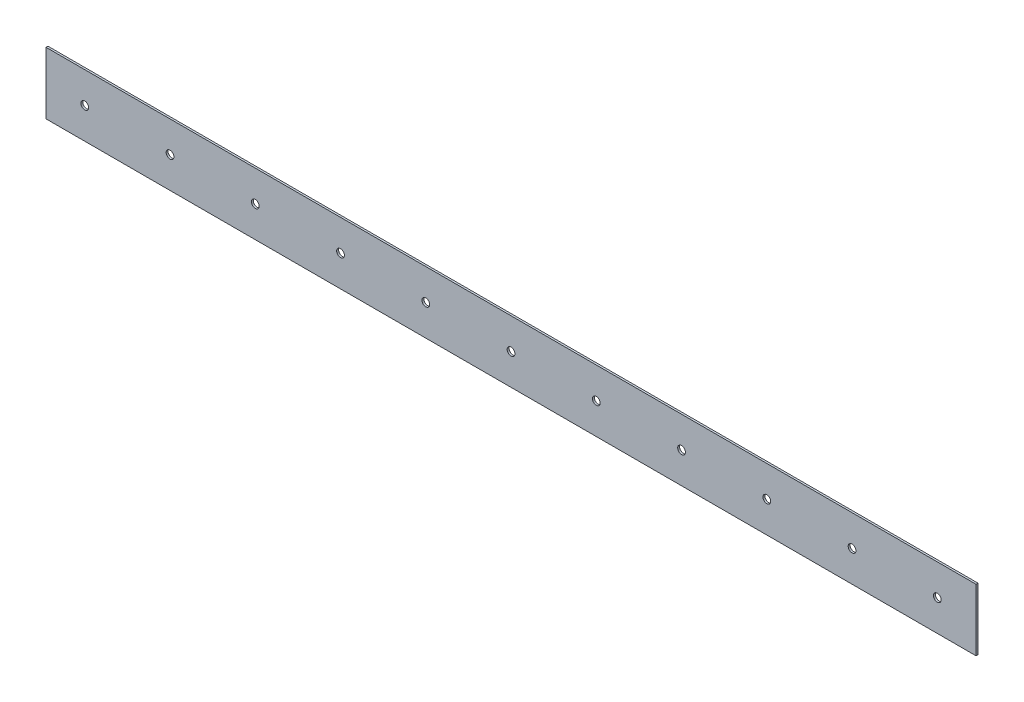
ISO-10303-21;
HEADER;
FILE_DESCRIPTION(('STEP AP214'),'2;1');
FILE_NAME('part.step','',(''),(''),'','','');
FILE_SCHEMA(('AUTOMOTIVE_DESIGN { 1 0 10303 214 1 1 1 1 }'));
ENDSEC;
DATA;
#1=APPLICATION_CONTEXT('core data for automotive mechanical design processes');
#2=APPLICATION_PROTOCOL_DEFINITION('international standard','automotive_design',2000,#1);
#3=PRODUCT_CONTEXT('',#1,'mechanical');
#4=PRODUCT('Part','Part','',(#3));
#5=PRODUCT_RELATED_PRODUCT_CATEGORY('part','',(#4));
#6=PRODUCT_DEFINITION_FORMATION('','',#4);
#7=PRODUCT_DEFINITION_CONTEXT('part definition',#1,'design');
#8=PRODUCT_DEFINITION('design','',#6,#7);
#9=PRODUCT_DEFINITION_SHAPE('','',#8);
#10=(LENGTH_UNIT() NAMED_UNIT(*) SI_UNIT(.MILLI.,.METRE.));
#11=(NAMED_UNIT(*) PLANE_ANGLE_UNIT() SI_UNIT($,.RADIAN.));
#12=(NAMED_UNIT(*) SI_UNIT($,.STERADIAN.) SOLID_ANGLE_UNIT());
#13=UNCERTAINTY_MEASURE_WITH_UNIT(LENGTH_MEASURE(1.E-05),#10,'distance_accuracy_value','');
#14=(GEOMETRIC_REPRESENTATION_CONTEXT(3) GLOBAL_UNCERTAINTY_ASSIGNED_CONTEXT((#13)) GLOBAL_UNIT_ASSIGNED_CONTEXT((#10,
#11,#12)) REPRESENTATION_CONTEXT('',''));
#15=CARTESIAN_POINT('',(0.,0.,0.));
#16=DIRECTION('',(0.,0.,1.));
#17=DIRECTION('',(1.,0.,0.));
#18=AXIS2_PLACEMENT_3D('',#15,#16,#17);
#19=CARTESIAN_POINT('',(0.,0.,6.35));
#20=DIRECTION('',(0.,0.,1.));
#21=DIRECTION('',(1.,0.,0.));
#22=AXIS2_PLACEMENT_3D('',#19,#20,#21);
#23=PLANE('',#22);
#24=CARTESIAN_POINT('',(1117.6,0.,6.35));
#25=DIRECTION('',(0.,0.,1.));
#26=DIRECTION('',(1.,0.,0.));
#27=AXIS2_PLACEMENT_3D('',#24,#25,#26);
#28=CIRCLE('',#27,12.6999999999999);
#29=CARTESIAN_POINT('',(1130.3,0.,6.35));
#30=VERTEX_POINT('',#29);
#31=EDGE_CURVE('E198',#30,#30,#28,.T.);
#32=ORIENTED_EDGE('',*,*,#31,.F.);
#33=EDGE_LOOP('',(#32));
#34=FACE_BOUND('',#33,.T.);
#35=CARTESIAN_POINT('',(558.8,0.,6.35));
#36=DIRECTION('',(0.,0.,1.));
#37=DIRECTION('',(1.,0.,0.));
#38=AXIS2_PLACEMENT_3D('',#35,#36,#37);
#39=CIRCLE('',#38,12.6999999999999);
#40=CARTESIAN_POINT('',(571.5,0.,6.35));
#41=VERTEX_POINT('',#40);
#42=EDGE_CURVE('E182',#41,#41,#39,.T.);
#43=ORIENTED_EDGE('',*,*,#42,.F.);
#44=EDGE_LOOP('',(#43));
#45=FACE_BOUND('',#44,.T.);
#46=CARTESIAN_POINT('',(-4.44089209850063E-13,0.,6.35));
#47=DIRECTION('',(0.,0.,1.));
#48=DIRECTION('',(1.,0.,0.));
#49=AXIS2_PLACEMENT_3D('',#46,#47,#48);
#50=CIRCLE('',#49,12.6999999999999);
#51=CARTESIAN_POINT('',(12.6999999999994,0.,6.35));
#52=VERTEX_POINT('',#51);
#53=EDGE_CURVE('E166',#52,#52,#50,.T.);
#54=ORIENTED_EDGE('',*,*,#53,.F.);
#55=EDGE_LOOP('',(#54));
#56=FACE_BOUND('',#55,.T.);
#57=CARTESIAN_POINT('',(-558.8,0.,6.35));
#58=DIRECTION('',(0.,0.,1.));
#59=DIRECTION('',(1.,0.,0.));
#60=AXIS2_PLACEMENT_3D('',#57,#58,#59);
#61=CIRCLE('',#60,12.6999999999999);
#62=CARTESIAN_POINT('',(-546.1,0.,6.35));
#63=VERTEX_POINT('',#62);
#64=EDGE_CURVE('E150',#63,#63,#61,.T.);
#65=ORIENTED_EDGE('',*,*,#64,.F.);
#66=EDGE_LOOP('',(#65));
#67=FACE_BOUND('',#66,.T.);
#68=CARTESIAN_POINT('',(-1117.6,0.,6.35));
#69=DIRECTION('',(0.,0.,1.));
#70=DIRECTION('',(1.,0.,0.));
#71=AXIS2_PLACEMENT_3D('',#68,#69,#70);
#72=CIRCLE('',#71,12.6999999999999);
#73=CARTESIAN_POINT('',(-1104.9,0.,6.35));
#74=VERTEX_POINT('',#73);
#75=EDGE_CURVE('E134',#74,#74,#72,.T.);
#76=ORIENTED_EDGE('',*,*,#75,.F.);
#77=EDGE_LOOP('',(#76));
#78=FACE_BOUND('',#77,.T.);
#79=DIRECTION('',(0.,1.,0.));
#80=VECTOR('',#79,1.);
#81=CARTESIAN_POINT('',(1524.,101.6,6.35));
#82=LINE('',#81,#80);
#83=CARTESIAN_POINT('',(1524.,-101.6,6.35));
#84=VERTEX_POINT('',#83);
#85=CARTESIAN_POINT('',(1524.,101.6,6.35));
#86=VERTEX_POINT('',#85);
#87=EDGE_CURVE('E92',#84,#86,#82,.T.);
#88=ORIENTED_EDGE('',*,*,#87,.T.);
#89=DIRECTION('',(-1.,0.,0.));
#90=VECTOR('',#89,1.);
#91=CARTESIAN_POINT('',(-1524.,101.6,6.35));
#92=LINE('',#91,#90);
#93=CARTESIAN_POINT('',(-1524.,101.6,6.35));
#94=VERTEX_POINT('',#93);
#95=EDGE_CURVE('E87',#86,#94,#92,.T.);
#96=ORIENTED_EDGE('',*,*,#95,.T.);
#97=DIRECTION('',(0.,-1.,0.));
#98=VECTOR('',#97,1.);
#99=CARTESIAN_POINT('',(-1524.,101.6,6.35));
#100=LINE('',#99,#98);
#101=CARTESIAN_POINT('',(-1524.,-101.6,6.35));
#102=VERTEX_POINT('',#101);
#103=EDGE_CURVE('E90',#94,#102,#100,.T.);
#104=ORIENTED_EDGE('',*,*,#103,.T.);
#105=DIRECTION('',(1.,0.,0.));
#106=VECTOR('',#105,1.);
#107=CARTESIAN_POINT('',(-1524.,-101.6,6.35));
#108=LINE('',#107,#106);
#109=EDGE_CURVE('E57',#102,#84,#108,.T.);
#110=ORIENTED_EDGE('',*,*,#109,.T.);
#111=EDGE_LOOP('',(#88,#96,#104,#110));
#112=FACE_BOUND('',#111,.T.);
#113=CARTESIAN_POINT('',(-1397.,0.,6.35));
#114=DIRECTION('',(0.,0.,1.));
#115=DIRECTION('',(1.,0.,0.));
#116=AXIS2_PLACEMENT_3D('',#113,#114,#115);
#117=CIRCLE('',#116,12.6999999999999);
#118=CARTESIAN_POINT('',(-1384.3,0.,6.35));
#119=VERTEX_POINT('',#118);
#120=EDGE_CURVE('E112',#119,#119,#117,.T.);
#121=ORIENTED_EDGE('',*,*,#120,.F.);
#122=EDGE_LOOP('',(#121));
#123=FACE_BOUND('',#122,.T.);
#124=CARTESIAN_POINT('',(-838.2,0.,6.35));
#125=DIRECTION('',(0.,0.,1.));
#126=DIRECTION('',(1.,0.,0.));
#127=AXIS2_PLACEMENT_3D('',#124,#125,#126);
#128=CIRCLE('',#127,12.6999999999999);
#129=CARTESIAN_POINT('',(-825.5,0.,6.35));
#130=VERTEX_POINT('',#129);
#131=EDGE_CURVE('E142',#130,#130,#128,.T.);
#132=ORIENTED_EDGE('',*,*,#131,.F.);
#133=EDGE_LOOP('',(#132));
#134=FACE_BOUND('',#133,.T.);
#135=CARTESIAN_POINT('',(-279.4,0.,6.35));
#136=DIRECTION('',(0.,0.,1.));
#137=DIRECTION('',(1.,0.,0.));
#138=AXIS2_PLACEMENT_3D('',#135,#136,#137);
#139=CIRCLE('',#138,12.6999999999999);
#140=CARTESIAN_POINT('',(-266.7,0.,6.35));
#141=VERTEX_POINT('',#140);
#142=EDGE_CURVE('E158',#141,#141,#139,.T.);
#143=ORIENTED_EDGE('',*,*,#142,.F.);
#144=EDGE_LOOP('',(#143));
#145=FACE_BOUND('',#144,.T.);
#146=CARTESIAN_POINT('',(279.4,0.,6.35));
#147=DIRECTION('',(0.,0.,1.));
#148=DIRECTION('',(1.,0.,0.));
#149=AXIS2_PLACEMENT_3D('',#146,#147,#148);
#150=CIRCLE('',#149,12.6999999999999);
#151=CARTESIAN_POINT('',(292.1,0.,6.35));
#152=VERTEX_POINT('',#151);
#153=EDGE_CURVE('E174',#152,#152,#150,.T.);
#154=ORIENTED_EDGE('',*,*,#153,.F.);
#155=EDGE_LOOP('',(#154));
#156=FACE_BOUND('',#155,.T.);
#157=CARTESIAN_POINT('',(838.2,0.,6.35));
#158=DIRECTION('',(0.,0.,1.));
#159=DIRECTION('',(1.,0.,0.));
#160=AXIS2_PLACEMENT_3D('',#157,#158,#159);
#161=CIRCLE('',#160,12.6999999999999);
#162=CARTESIAN_POINT('',(850.9,0.,6.35));
#163=VERTEX_POINT('',#162);
#164=EDGE_CURVE('E190',#163,#163,#161,.T.);
#165=ORIENTED_EDGE('',*,*,#164,.F.);
#166=EDGE_LOOP('',(#165));
#167=FACE_BOUND('',#166,.T.);
#168=CARTESIAN_POINT('',(1397.,0.,6.35));
#169=DIRECTION('',(0.,0.,1.));
#170=DIRECTION('',(1.,0.,0.));
#171=AXIS2_PLACEMENT_3D('',#168,#169,#170);
#172=CIRCLE('',#171,12.6999999999999);
#173=CARTESIAN_POINT('',(1409.7,0.,6.35));
#174=VERTEX_POINT('',#173);
#175=EDGE_CURVE('E206',#174,#174,#172,.T.);
#176=ORIENTED_EDGE('',*,*,#175,.F.);
#177=EDGE_LOOP('',(#176));
#178=FACE_BOUND('',#177,.T.);
#179=ADVANCED_FACE('F39',(#34,#45,#56,#67,#78,#112,#123,#134,#145,#156,#167,#178),#23,.T.);
#180=CARTESIAN_POINT('',(0.,0.,0.));
#181=DIRECTION('',(0.,0.,1.));
#182=DIRECTION('',(1.,0.,0.));
#183=AXIS2_PLACEMENT_3D('',#180,#181,#182);
#184=PLANE('',#183);
#185=DIRECTION('',(0.,1.,0.));
#186=VECTOR('',#185,1.);
#187=CARTESIAN_POINT('',(1524.,101.6,0.));
#188=LINE('',#187,#186);
#189=CARTESIAN_POINT('',(1524.,-101.6,0.));
#190=VERTEX_POINT('',#189);
#191=CARTESIAN_POINT('',(1524.,101.6,0.));
#192=VERTEX_POINT('',#191);
#193=EDGE_CURVE('E108',#190,#192,#188,.T.);
#194=ORIENTED_EDGE('',*,*,#193,.F.);
#195=DIRECTION('',(1.,0.,0.));
#196=VECTOR('',#195,1.);
#197=CARTESIAN_POINT('',(-1524.,-101.6,0.));
#198=LINE('',#197,#196);
#199=CARTESIAN_POINT('',(-1524.,-101.6,0.));
#200=VERTEX_POINT('',#199);
#201=EDGE_CURVE('E80',#200,#190,#198,.T.);
#202=ORIENTED_EDGE('',*,*,#201,.F.);
#203=DIRECTION('',(0.,-1.,0.));
#204=VECTOR('',#203,1.);
#205=CARTESIAN_POINT('',(-1524.,101.6,0.));
#206=LINE('',#205,#204);
#207=CARTESIAN_POINT('',(-1524.,101.6,0.));
#208=VERTEX_POINT('',#207);
#209=EDGE_CURVE('E74',#208,#200,#206,.T.);
#210=ORIENTED_EDGE('',*,*,#209,.F.);
#211=DIRECTION('',(-1.,0.,0.));
#212=VECTOR('',#211,1.);
#213=CARTESIAN_POINT('',(-1524.,101.6,0.));
#214=LINE('',#213,#212);
#215=EDGE_CURVE('E97',#192,#208,#214,.T.);
#216=ORIENTED_EDGE('',*,*,#215,.F.);
#217=EDGE_LOOP('',(#194,#202,#210,#216));
#218=FACE_BOUND('',#217,.T.);
#219=CARTESIAN_POINT('',(-1397.,0.,0.));
#220=DIRECTION('',(0.,0.,1.));
#221=DIRECTION('',(1.,0.,0.));
#222=AXIS2_PLACEMENT_3D('',#219,#220,#221);
#223=CIRCLE('',#222,12.6999999999999);
#224=CARTESIAN_POINT('',(-1384.3,0.,0.));
#225=VERTEX_POINT('',#224);
#226=EDGE_CURVE('E130',#225,#225,#223,.T.);
#227=ORIENTED_EDGE('',*,*,#226,.T.);
#228=EDGE_LOOP('',(#227));
#229=FACE_BOUND('',#228,.T.);
#230=CARTESIAN_POINT('',(-1117.6,0.,0.));
#231=DIRECTION('',(0.,0.,1.));
#232=DIRECTION('',(1.,0.,0.));
#233=AXIS2_PLACEMENT_3D('',#230,#231,#232);
#234=CIRCLE('',#233,12.6999999999999);
#235=CARTESIAN_POINT('',(-1104.9,0.,0.));
#236=VERTEX_POINT('',#235);
#237=EDGE_CURVE('E138',#236,#236,#234,.T.);
#238=ORIENTED_EDGE('',*,*,#237,.T.);
#239=EDGE_LOOP('',(#238));
#240=FACE_BOUND('',#239,.T.);
#241=CARTESIAN_POINT('',(-838.2,0.,0.));
#242=DIRECTION('',(0.,0.,1.));
#243=DIRECTION('',(1.,0.,0.));
#244=AXIS2_PLACEMENT_3D('',#241,#242,#243);
#245=CIRCLE('',#244,12.6999999999999);
#246=CARTESIAN_POINT('',(-825.5,0.,0.));
#247=VERTEX_POINT('',#246);
#248=EDGE_CURVE('E146',#247,#247,#245,.T.);
#249=ORIENTED_EDGE('',*,*,#248,.T.);
#250=EDGE_LOOP('',(#249));
#251=FACE_BOUND('',#250,.T.);
#252=CARTESIAN_POINT('',(-558.8,0.,0.));
#253=DIRECTION('',(0.,0.,1.));
#254=DIRECTION('',(1.,0.,0.));
#255=AXIS2_PLACEMENT_3D('',#252,#253,#254);
#256=CIRCLE('',#255,12.6999999999999);
#257=CARTESIAN_POINT('',(-546.1,0.,0.));
#258=VERTEX_POINT('',#257);
#259=EDGE_CURVE('E154',#258,#258,#256,.T.);
#260=ORIENTED_EDGE('',*,*,#259,.T.);
#261=EDGE_LOOP('',(#260));
#262=FACE_BOUND('',#261,.T.);
#263=CARTESIAN_POINT('',(-279.4,0.,0.));
#264=DIRECTION('',(0.,0.,1.));
#265=DIRECTION('',(1.,0.,0.));
#266=AXIS2_PLACEMENT_3D('',#263,#264,#265);
#267=CIRCLE('',#266,12.6999999999999);
#268=CARTESIAN_POINT('',(-266.7,0.,0.));
#269=VERTEX_POINT('',#268);
#270=EDGE_CURVE('E162',#269,#269,#267,.T.);
#271=ORIENTED_EDGE('',*,*,#270,.T.);
#272=EDGE_LOOP('',(#271));
#273=FACE_BOUND('',#272,.T.);
#274=CARTESIAN_POINT('',(-4.44089209850063E-13,0.,0.));
#275=DIRECTION('',(0.,0.,1.));
#276=DIRECTION('',(1.,0.,0.));
#277=AXIS2_PLACEMENT_3D('',#274,#275,#276);
#278=CIRCLE('',#277,12.6999999999999);
#279=CARTESIAN_POINT('',(12.6999999999994,0.,0.));
#280=VERTEX_POINT('',#279);
#281=EDGE_CURVE('E170',#280,#280,#278,.T.);
#282=ORIENTED_EDGE('',*,*,#281,.T.);
#283=EDGE_LOOP('',(#282));
#284=FACE_BOUND('',#283,.T.);
#285=CARTESIAN_POINT('',(279.4,0.,0.));
#286=DIRECTION('',(0.,0.,1.));
#287=DIRECTION('',(1.,0.,0.));
#288=AXIS2_PLACEMENT_3D('',#285,#286,#287);
#289=CIRCLE('',#288,12.6999999999999);
#290=CARTESIAN_POINT('',(292.1,0.,0.));
#291=VERTEX_POINT('',#290);
#292=EDGE_CURVE('E178',#291,#291,#289,.T.);
#293=ORIENTED_EDGE('',*,*,#292,.T.);
#294=EDGE_LOOP('',(#293));
#295=FACE_BOUND('',#294,.T.);
#296=CARTESIAN_POINT('',(558.8,0.,0.));
#297=DIRECTION('',(0.,0.,1.));
#298=DIRECTION('',(1.,0.,0.));
#299=AXIS2_PLACEMENT_3D('',#296,#297,#298);
#300=CIRCLE('',#299,12.6999999999999);
#301=CARTESIAN_POINT('',(571.5,0.,0.));
#302=VERTEX_POINT('',#301);
#303=EDGE_CURVE('E186',#302,#302,#300,.T.);
#304=ORIENTED_EDGE('',*,*,#303,.T.);
#305=EDGE_LOOP('',(#304));
#306=FACE_BOUND('',#305,.T.);
#307=CARTESIAN_POINT('',(838.2,0.,0.));
#308=DIRECTION('',(0.,0.,1.));
#309=DIRECTION('',(1.,0.,0.));
#310=AXIS2_PLACEMENT_3D('',#307,#308,#309);
#311=CIRCLE('',#310,12.6999999999999);
#312=CARTESIAN_POINT('',(850.9,0.,0.));
#313=VERTEX_POINT('',#312);
#314=EDGE_CURVE('E194',#313,#313,#311,.T.);
#315=ORIENTED_EDGE('',*,*,#314,.T.);
#316=EDGE_LOOP('',(#315));
#317=FACE_BOUND('',#316,.T.);
#318=CARTESIAN_POINT('',(1117.6,0.,0.));
#319=DIRECTION('',(0.,0.,1.));
#320=DIRECTION('',(1.,0.,0.));
#321=AXIS2_PLACEMENT_3D('',#318,#319,#320);
#322=CIRCLE('',#321,12.6999999999999);
#323=CARTESIAN_POINT('',(1130.3,0.,0.));
#324=VERTEX_POINT('',#323);
#325=EDGE_CURVE('E202',#324,#324,#322,.T.);
#326=ORIENTED_EDGE('',*,*,#325,.T.);
#327=EDGE_LOOP('',(#326));
#328=FACE_BOUND('',#327,.T.);
#329=CARTESIAN_POINT('',(1397.,0.,0.));
#330=DIRECTION('',(0.,0.,1.));
#331=DIRECTION('',(1.,0.,0.));
#332=AXIS2_PLACEMENT_3D('',#329,#330,#331);
#333=CIRCLE('',#332,12.6999999999999);
#334=CARTESIAN_POINT('',(1409.7,0.,0.));
#335=VERTEX_POINT('',#334);
#336=EDGE_CURVE('E210',#335,#335,#333,.T.);
#337=ORIENTED_EDGE('',*,*,#336,.T.);
#338=EDGE_LOOP('',(#337));
#339=FACE_BOUND('',#338,.T.);
#340=ADVANCED_FACE('F125',(#218,#229,#240,#251,#262,#273,#284,#295,#306,#317,#328,#339),#184,.F.);
#341=CARTESIAN_POINT('',(1524.,101.6,6.35));
#342=DIRECTION('',(-1.,0.,0.));
#343=DIRECTION('',(0.,0.,1.));
#344=AXIS2_PLACEMENT_3D('',#341,#342,#343);
#345=PLANE('',#344);
#346=ORIENTED_EDGE('',*,*,#193,.T.);
#347=DIRECTION('',(0.,0.,-1.));
#348=VECTOR('',#347,1.);
#349=CARTESIAN_POINT('',(1524.,101.6,6.35));
#350=LINE('',#349,#348);
#351=EDGE_CURVE('E11',#86,#192,#350,.T.);
#352=ORIENTED_EDGE('',*,*,#351,.F.);
#353=ORIENTED_EDGE('',*,*,#87,.F.);
#354=DIRECTION('',(0.,0.,-1.));
#355=VECTOR('',#354,1.);
#356=CARTESIAN_POINT('',(1524.,-101.6,6.35));
#357=LINE('',#356,#355);
#358=EDGE_CURVE('E104',#84,#190,#357,.T.);
#359=ORIENTED_EDGE('',*,*,#358,.T.);
#360=EDGE_LOOP('',(#346,#352,#353,#359));
#361=FACE_BOUND('',#360,.T.);
#362=ADVANCED_FACE('F41',(#361),#345,.F.);
#363=CARTESIAN_POINT('',(-1524.,101.6,6.35));
#364=DIRECTION('',(0.,-1.,0.));
#365=DIRECTION('',(1.,0.,0.));
#366=AXIS2_PLACEMENT_3D('',#363,#364,#365);
#367=PLANE('',#366);
#368=ORIENTED_EDGE('',*,*,#215,.T.);
#369=DIRECTION('',(0.,0.,-1.));
#370=VECTOR('',#369,1.);
#371=CARTESIAN_POINT('',(-1524.,101.6,6.35));
#372=LINE('',#371,#370);
#373=EDGE_CURVE('E49',#94,#208,#372,.T.);
#374=ORIENTED_EDGE('',*,*,#373,.F.);
#375=ORIENTED_EDGE('',*,*,#95,.F.);
#376=ORIENTED_EDGE('',*,*,#351,.T.);
#377=EDGE_LOOP('',(#368,#374,#375,#376));
#378=FACE_BOUND('',#377,.T.);
#379=ADVANCED_FACE('F96',(#378),#367,.F.);
#380=CARTESIAN_POINT('',(-1524.,101.6,6.35));
#381=DIRECTION('',(1.,0.,0.));
#382=DIRECTION('',(0.,0.,-1.));
#383=AXIS2_PLACEMENT_3D('',#380,#381,#382);
#384=PLANE('',#383);
#385=ORIENTED_EDGE('',*,*,#209,.T.);
#386=DIRECTION('',(0.,0.,-1.));
#387=VECTOR('',#386,1.);
#388=CARTESIAN_POINT('',(-1524.,-101.6,6.35));
#389=LINE('',#388,#387);
#390=EDGE_CURVE('E99',#102,#200,#389,.T.);
#391=ORIENTED_EDGE('',*,*,#390,.F.);
#392=ORIENTED_EDGE('',*,*,#103,.F.);
#393=ORIENTED_EDGE('',*,*,#373,.T.);
#394=EDGE_LOOP('',(#385,#391,#392,#393));
#395=FACE_BOUND('',#394,.T.);
#396=ADVANCED_FACE('F100',(#395),#384,.F.);
#397=CARTESIAN_POINT('',(-1524.,-101.6,6.35));
#398=DIRECTION('',(0.,1.,0.));
#399=DIRECTION('',(0.,0.,1.));
#400=AXIS2_PLACEMENT_3D('',#397,#398,#399);
#401=PLANE('',#400);
#402=ORIENTED_EDGE('',*,*,#201,.T.);
#403=ORIENTED_EDGE('',*,*,#358,.F.);
#404=ORIENTED_EDGE('',*,*,#109,.F.);
#405=ORIENTED_EDGE('',*,*,#390,.T.);
#406=EDGE_LOOP('',(#402,#403,#404,#405));
#407=FACE_BOUND('',#406,.T.);
#408=ADVANCED_FACE('F122',(#407),#401,.F.);
#409=CARTESIAN_POINT('',(-1397.,0.,6.35));
#410=DIRECTION('',(0.,0.,-1.));
#411=DIRECTION('',(-1.,0.,0.));
#412=AXIS2_PLACEMENT_3D('',#409,#410,#411);
#413=CYLINDRICAL_SURFACE('',#412,12.6999999999999);
#414=ORIENTED_EDGE('',*,*,#120,.T.);
#415=EDGE_LOOP('',(#414));
#416=FACE_BOUND('',#415,.T.);
#417=ORIENTED_EDGE('',*,*,#226,.F.);
#418=EDGE_LOOP('',(#417));
#419=FACE_BOUND('',#418,.T.);
#420=ADVANCED_FACE('F231',(#416,#419),#413,.F.);
#421=CARTESIAN_POINT('',(-1117.6,0.,6.35));
#422=DIRECTION('',(0.,0.,-1.));
#423=DIRECTION('',(-1.,0.,0.));
#424=AXIS2_PLACEMENT_3D('',#421,#422,#423);
#425=CYLINDRICAL_SURFACE('',#424,12.6999999999999);
#426=ORIENTED_EDGE('',*,*,#75,.T.);
#427=EDGE_LOOP('',(#426));
#428=FACE_BOUND('',#427,.T.);
#429=ORIENTED_EDGE('',*,*,#237,.F.);
#430=EDGE_LOOP('',(#429));
#431=FACE_BOUND('',#430,.T.);
#432=ADVANCED_FACE('F277',(#428,#431),#425,.F.);
#433=CARTESIAN_POINT('',(-838.2,0.,6.35));
#434=DIRECTION('',(0.,0.,-1.));
#435=DIRECTION('',(-1.,0.,0.));
#436=AXIS2_PLACEMENT_3D('',#433,#434,#435);
#437=CYLINDRICAL_SURFACE('',#436,12.6999999999999);
#438=ORIENTED_EDGE('',*,*,#131,.T.);
#439=EDGE_LOOP('',(#438));
#440=FACE_BOUND('',#439,.T.);
#441=ORIENTED_EDGE('',*,*,#248,.F.);
#442=EDGE_LOOP('',(#441));
#443=FACE_BOUND('',#442,.T.);
#444=ADVANCED_FACE('F285',(#440,#443),#437,.F.);
#445=CARTESIAN_POINT('',(-558.8,0.,6.35));
#446=DIRECTION('',(0.,0.,-1.));
#447=DIRECTION('',(-1.,0.,0.));
#448=AXIS2_PLACEMENT_3D('',#445,#446,#447);
#449=CYLINDRICAL_SURFACE('',#448,12.6999999999999);
#450=ORIENTED_EDGE('',*,*,#64,.T.);
#451=EDGE_LOOP('',(#450));
#452=FACE_BOUND('',#451,.T.);
#453=ORIENTED_EDGE('',*,*,#259,.F.);
#454=EDGE_LOOP('',(#453));
#455=FACE_BOUND('',#454,.T.);
#456=ADVANCED_FACE('F293',(#452,#455),#449,.F.);
#457=CARTESIAN_POINT('',(-279.4,0.,6.35));
#458=DIRECTION('',(0.,0.,-1.));
#459=DIRECTION('',(-1.,0.,0.));
#460=AXIS2_PLACEMENT_3D('',#457,#458,#459);
#461=CYLINDRICAL_SURFACE('',#460,12.6999999999999);
#462=ORIENTED_EDGE('',*,*,#142,.T.);
#463=EDGE_LOOP('',(#462));
#464=FACE_BOUND('',#463,.T.);
#465=ORIENTED_EDGE('',*,*,#270,.F.);
#466=EDGE_LOOP('',(#465));
#467=FACE_BOUND('',#466,.T.);
#468=ADVANCED_FACE('F302',(#464,#467),#461,.F.);
#469=CARTESIAN_POINT('',(-4.44089209850063E-13,0.,6.35));
#470=DIRECTION('',(0.,0.,-1.));
#471=DIRECTION('',(-1.,0.,0.));
#472=AXIS2_PLACEMENT_3D('',#469,#470,#471);
#473=CYLINDRICAL_SURFACE('',#472,12.6999999999999);
#474=ORIENTED_EDGE('',*,*,#53,.T.);
#475=EDGE_LOOP('',(#474));
#476=FACE_BOUND('',#475,.T.);
#477=ORIENTED_EDGE('',*,*,#281,.F.);
#478=EDGE_LOOP('',(#477));
#479=FACE_BOUND('',#478,.T.);
#480=ADVANCED_FACE('F311',(#476,#479),#473,.F.);
#481=CARTESIAN_POINT('',(279.4,0.,6.35));
#482=DIRECTION('',(0.,0.,-1.));
#483=DIRECTION('',(-1.,0.,0.));
#484=AXIS2_PLACEMENT_3D('',#481,#482,#483);
#485=CYLINDRICAL_SURFACE('',#484,12.6999999999999);
#486=ORIENTED_EDGE('',*,*,#153,.T.);
#487=EDGE_LOOP('',(#486));
#488=FACE_BOUND('',#487,.T.);
#489=ORIENTED_EDGE('',*,*,#292,.F.);
#490=EDGE_LOOP('',(#489));
#491=FACE_BOUND('',#490,.T.);
#492=ADVANCED_FACE('F320',(#488,#491),#485,.F.);
#493=CARTESIAN_POINT('',(558.8,0.,6.35));
#494=DIRECTION('',(0.,0.,-1.));
#495=DIRECTION('',(-1.,0.,0.));
#496=AXIS2_PLACEMENT_3D('',#493,#494,#495);
#497=CYLINDRICAL_SURFACE('',#496,12.6999999999999);
#498=ORIENTED_EDGE('',*,*,#42,.T.);
#499=EDGE_LOOP('',(#498));
#500=FACE_BOUND('',#499,.T.);
#501=ORIENTED_EDGE('',*,*,#303,.F.);
#502=EDGE_LOOP('',(#501));
#503=FACE_BOUND('',#502,.T.);
#504=ADVANCED_FACE('F329',(#500,#503),#497,.F.);
#505=CARTESIAN_POINT('',(838.2,0.,6.35));
#506=DIRECTION('',(0.,0.,-1.));
#507=DIRECTION('',(-1.,0.,0.));
#508=AXIS2_PLACEMENT_3D('',#505,#506,#507);
#509=CYLINDRICAL_SURFACE('',#508,12.6999999999999);
#510=ORIENTED_EDGE('',*,*,#164,.T.);
#511=EDGE_LOOP('',(#510));
#512=FACE_BOUND('',#511,.T.);
#513=ORIENTED_EDGE('',*,*,#314,.F.);
#514=EDGE_LOOP('',(#513));
#515=FACE_BOUND('',#514,.T.);
#516=ADVANCED_FACE('F338',(#512,#515),#509,.F.);
#517=CARTESIAN_POINT('',(1117.6,0.,6.35));
#518=DIRECTION('',(0.,0.,-1.));
#519=DIRECTION('',(-1.,0.,0.));
#520=AXIS2_PLACEMENT_3D('',#517,#518,#519);
#521=CYLINDRICAL_SURFACE('',#520,12.6999999999999);
#522=ORIENTED_EDGE('',*,*,#31,.T.);
#523=EDGE_LOOP('',(#522));
#524=FACE_BOUND('',#523,.T.);
#525=ORIENTED_EDGE('',*,*,#325,.F.);
#526=EDGE_LOOP('',(#525));
#527=FACE_BOUND('',#526,.T.);
#528=ADVANCED_FACE('F347',(#524,#527),#521,.F.);
#529=CARTESIAN_POINT('',(1397.,0.,6.35));
#530=DIRECTION('',(0.,0.,-1.));
#531=DIRECTION('',(-1.,0.,0.));
#532=AXIS2_PLACEMENT_3D('',#529,#530,#531);
#533=CYLINDRICAL_SURFACE('',#532,12.6999999999999);
#534=ORIENTED_EDGE('',*,*,#175,.T.);
#535=EDGE_LOOP('',(#534));
#536=FACE_BOUND('',#535,.T.);
#537=ORIENTED_EDGE('',*,*,#336,.F.);
#538=EDGE_LOOP('',(#537));
#539=FACE_BOUND('',#538,.T.);
#540=ADVANCED_FACE('F218',(#536,#539),#533,.F.);
#541=CLOSED_SHELL('',(#179,#340,#362,#379,#396,#408,#420,#432,#444,#456,#468,#480,#492,#504,
#516,#528,#540));
#542=MANIFOLD_SOLID_BREP('B2',#541);
#543=ADVANCED_BREP_SHAPE_REPRESENTATION('',(#18,#542),#14);
#544=SHAPE_DEFINITION_REPRESENTATION(#9,#543);
ENDSEC;
END-ISO-10303-21;
